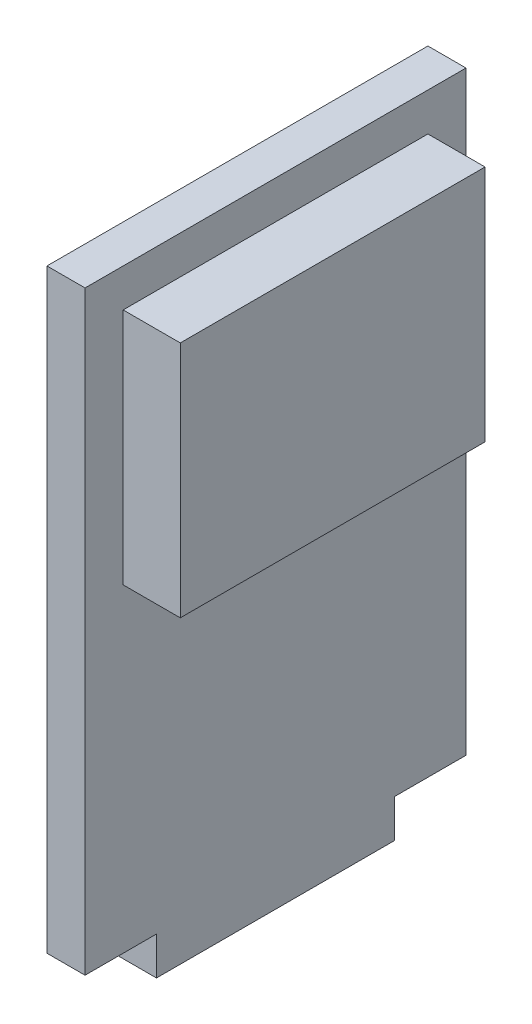
ISO-10303-21;
HEADER;
FILE_DESCRIPTION(('STEP AP214'),'2;1');
FILE_NAME('part.step','',(''),(''),'','','');
FILE_SCHEMA(('AUTOMOTIVE_DESIGN { 1 0 10303 214 1 1 1 1 }'));
ENDSEC;
DATA;
#1=APPLICATION_CONTEXT('core data for automotive mechanical design processes');
#2=APPLICATION_PROTOCOL_DEFINITION('international standard','automotive_design',2000,#1);
#3=PRODUCT_CONTEXT('',#1,'mechanical');
#4=PRODUCT('Part','Part','',(#3));
#5=PRODUCT_RELATED_PRODUCT_CATEGORY('part','',(#4));
#6=PRODUCT_DEFINITION_FORMATION('','',#4);
#7=PRODUCT_DEFINITION_CONTEXT('part definition',#1,'design');
#8=PRODUCT_DEFINITION('design','',#6,#7);
#9=PRODUCT_DEFINITION_SHAPE('','',#8);
#10=(LENGTH_UNIT() NAMED_UNIT(*) SI_UNIT(.MILLI.,.METRE.));
#11=(NAMED_UNIT(*) PLANE_ANGLE_UNIT() SI_UNIT($,.RADIAN.));
#12=(NAMED_UNIT(*) SI_UNIT($,.STERADIAN.) SOLID_ANGLE_UNIT());
#13=UNCERTAINTY_MEASURE_WITH_UNIT(LENGTH_MEASURE(1.E-05),#10,'distance_accuracy_value','');
#14=(GEOMETRIC_REPRESENTATION_CONTEXT(3) GLOBAL_UNCERTAINTY_ASSIGNED_CONTEXT((#13)) GLOBAL_UNIT_ASSIGNED_CONTEXT((#10,
#11,#12)) REPRESENTATION_CONTEXT('',''));
#15=CARTESIAN_POINT('',(0.,0.,0.));
#16=DIRECTION('',(0.,0.,1.));
#17=DIRECTION('',(1.,0.,0.));
#18=AXIS2_PLACEMENT_3D('',#15,#16,#17);
#19=CARTESIAN_POINT('',(0.8,0.,0.));
#20=DIRECTION('',(-1.,0.,0.));
#21=DIRECTION('',(0.,0.,1.));
#22=AXIS2_PLACEMENT_3D('',#19,#20,#21);
#23=PLANE('',#22);
#24=DIRECTION('',(0.,-1.,0.));
#25=VECTOR('',#24,1.);
#26=CARTESIAN_POINT('',(0.8,0.,0.));
#27=LINE('',#26,#25);
#28=CARTESIAN_POINT('',(0.8,12.5,0.));
#29=VERTEX_POINT('',#28);
#30=CARTESIAN_POINT('',(0.8,0.,0.));
#31=VERTEX_POINT('',#30);
#32=EDGE_CURVE('E158',#29,#31,#27,.T.);
#33=ORIENTED_EDGE('',*,*,#32,.T.);
#34=DIRECTION('',(0.,0.,-1.));
#35=VECTOR('',#34,1.);
#36=CARTESIAN_POINT('',(0.8,0.,0.));
#37=LINE('',#36,#35);
#38=CARTESIAN_POINT('',(0.8,0.,-1.5));
#39=VERTEX_POINT('',#38);
#40=EDGE_CURVE('E161',#31,#39,#37,.T.);
#41=ORIENTED_EDGE('',*,*,#40,.T.);
#42=DIRECTION('',(0.,-1.,0.));
#43=VECTOR('',#42,1.);
#44=CARTESIAN_POINT('',(0.8,0.,-1.5));
#45=LINE('',#44,#43);
#46=CARTESIAN_POINT('',(0.8,-0.8,-1.5));
#47=VERTEX_POINT('',#46);
#48=EDGE_CURVE('E164',#39,#47,#45,.T.);
#49=ORIENTED_EDGE('',*,*,#48,.T.);
#50=DIRECTION('',(0.,0.,-1.));
#51=VECTOR('',#50,1.);
#52=CARTESIAN_POINT('',(0.8,-0.8,-1.5));
#53=LINE('',#52,#51);
#54=CARTESIAN_POINT('',(0.8,-0.8,-6.5));
#55=VERTEX_POINT('',#54);
#56=EDGE_CURVE('E166',#47,#55,#53,.T.);
#57=ORIENTED_EDGE('',*,*,#56,.T.);
#58=DIRECTION('',(0.,1.,0.));
#59=VECTOR('',#58,1.);
#60=CARTESIAN_POINT('',(0.8,-0.8,-6.5));
#61=LINE('',#60,#59);
#62=CARTESIAN_POINT('',(0.8,0.,-6.5));
#63=VERTEX_POINT('',#62);
#64=EDGE_CURVE('E168',#55,#63,#61,.T.);
#65=ORIENTED_EDGE('',*,*,#64,.T.);
#66=DIRECTION('',(0.,0.,-1.));
#67=VECTOR('',#66,1.);
#68=CARTESIAN_POINT('',(0.8,0.,-6.5));
#69=LINE('',#68,#67);
#70=CARTESIAN_POINT('',(0.8,0.,-8.));
#71=VERTEX_POINT('',#70);
#72=EDGE_CURVE('E170',#63,#71,#69,.T.);
#73=ORIENTED_EDGE('',*,*,#72,.T.);
#74=DIRECTION('',(0.,1.,0.));
#75=VECTOR('',#74,1.);
#76=CARTESIAN_POINT('',(0.8,0.,-8.));
#77=LINE('',#76,#75);
#78=CARTESIAN_POINT('',(0.8,12.5,-8.));
#79=VERTEX_POINT('',#78);
#80=EDGE_CURVE('E172',#71,#79,#77,.T.);
#81=ORIENTED_EDGE('',*,*,#80,.T.);
#82=DIRECTION('',(0.,0.,1.));
#83=VECTOR('',#82,1.);
#84=CARTESIAN_POINT('',(0.8,12.5,0.));
#85=LINE('',#84,#83);
#86=EDGE_CURVE('E174',#79,#29,#85,.T.);
#87=ORIENTED_EDGE('',*,*,#86,.T.);
#88=EDGE_LOOP('',(#33,#41,#49,#57,#65,#73,#81,#87));
#89=FACE_BOUND('',#88,.T.);
#90=DIRECTION('',(0.,-1.,0.));
#91=VECTOR('',#90,1.);
#92=CARTESIAN_POINT('',(0.8,11.7,-0.799999999999999));
#93=LINE('',#92,#91);
#94=CARTESIAN_POINT('',(0.8,11.7,-0.799999999999999));
#95=VERTEX_POINT('',#94);
#96=CARTESIAN_POINT('',(0.8,6.7,-0.8));
#97=VERTEX_POINT('',#96);
#98=EDGE_CURVE('E148',#95,#97,#93,.T.);
#99=ORIENTED_EDGE('',*,*,#98,.F.);
#100=DIRECTION('',(0.,0.,1.));
#101=VECTOR('',#100,1.);
#102=CARTESIAN_POINT('',(0.8,11.7,-0.799999999999999));
#103=LINE('',#102,#101);
#104=CARTESIAN_POINT('',(0.8,11.7,-7.2));
#105=VERTEX_POINT('',#104);
#106=EDGE_CURVE('E145',#105,#95,#103,.T.);
#107=ORIENTED_EDGE('',*,*,#106,.F.);
#108=DIRECTION('',(0.,1.,0.));
#109=VECTOR('',#108,1.);
#110=CARTESIAN_POINT('',(0.8,11.7,-7.2));
#111=LINE('',#110,#109);
#112=CARTESIAN_POINT('',(0.8,6.7,-7.2));
#113=VERTEX_POINT('',#112);
#114=EDGE_CURVE('E59',#113,#105,#111,.T.);
#115=ORIENTED_EDGE('',*,*,#114,.F.);
#116=DIRECTION('',(0.,0.,-1.));
#117=VECTOR('',#116,1.);
#118=CARTESIAN_POINT('',(0.8,6.7,-0.8));
#119=LINE('',#118,#117);
#120=EDGE_CURVE('E54',#97,#113,#119,.T.);
#121=ORIENTED_EDGE('',*,*,#120,.F.);
#122=EDGE_LOOP('',(#99,#107,#115,#121));
#123=FACE_BOUND('',#122,.T.);
#124=ADVANCED_FACE('F39',(#89,#123),#23,.F.);
#125=CARTESIAN_POINT('',(0.8,0.,0.));
#126=DIRECTION('',(0.,0.,-1.));
#127=DIRECTION('',(-1.,0.,0.));
#128=AXIS2_PLACEMENT_3D('',#125,#126,#127);
#129=PLANE('',#128);
#130=DIRECTION('',(0.,-1.,0.));
#131=VECTOR('',#130,1.);
#132=CARTESIAN_POINT('',(0.,0.,0.));
#133=LINE('',#132,#131);
#134=CARTESIAN_POINT('',(0.,12.5,0.));
#135=VERTEX_POINT('',#134);
#136=CARTESIAN_POINT('',(0.,0.,0.));
#137=VERTEX_POINT('',#136);
#138=EDGE_CURVE('E149',#135,#137,#133,.T.);
#139=ORIENTED_EDGE('',*,*,#138,.T.);
#140=DIRECTION('',(-1.,0.,0.));
#141=VECTOR('',#140,1.);
#142=CARTESIAN_POINT('',(0.8,0.,0.));
#143=LINE('',#142,#141);
#144=EDGE_CURVE('E11',#31,#137,#143,.T.);
#145=ORIENTED_EDGE('',*,*,#144,.F.);
#146=ORIENTED_EDGE('',*,*,#32,.F.);
#147=DIRECTION('',(-1.,0.,0.));
#148=VECTOR('',#147,1.);
#149=CARTESIAN_POINT('',(0.8,12.5,0.));
#150=LINE('',#149,#148);
#151=EDGE_CURVE('E175',#29,#135,#150,.T.);
#152=ORIENTED_EDGE('',*,*,#151,.T.);
#153=EDGE_LOOP('',(#139,#145,#146,#152));
#154=FACE_BOUND('',#153,.T.);
#155=ADVANCED_FACE('F41',(#154),#129,.F.);
#156=CARTESIAN_POINT('',(0.8,0.,0.));
#157=DIRECTION('',(0.,1.,0.));
#158=DIRECTION('',(0.,0.,1.));
#159=AXIS2_PLACEMENT_3D('',#156,#157,#158);
#160=PLANE('',#159);
#161=DIRECTION('',(0.,0.,-1.));
#162=VECTOR('',#161,1.);
#163=CARTESIAN_POINT('',(0.,0.,0.));
#164=LINE('',#163,#162);
#165=CARTESIAN_POINT('',(0.,0.,-1.5));
#166=VERTEX_POINT('',#165);
#167=EDGE_CURVE('E152',#137,#166,#164,.T.);
#168=ORIENTED_EDGE('',*,*,#167,.T.);
#169=DIRECTION('',(-1.,0.,0.));
#170=VECTOR('',#169,1.);
#171=CARTESIAN_POINT('',(0.8,0.,-1.5));
#172=LINE('',#171,#170);
#173=EDGE_CURVE('E47',#39,#166,#172,.T.);
#174=ORIENTED_EDGE('',*,*,#173,.F.);
#175=ORIENTED_EDGE('',*,*,#40,.F.);
#176=ORIENTED_EDGE('',*,*,#144,.T.);
#177=EDGE_LOOP('',(#168,#174,#175,#176));
#178=FACE_BOUND('',#177,.T.);
#179=ADVANCED_FACE('F232',(#178),#160,.F.);
#180=CARTESIAN_POINT('',(0.8,0.,-1.5));
#181=DIRECTION('',(0.,0.,-1.));
#182=DIRECTION('',(-1.,0.,0.));
#183=AXIS2_PLACEMENT_3D('',#180,#181,#182);
#184=PLANE('',#183);
#185=DIRECTION('',(0.,-1.,0.));
#186=VECTOR('',#185,1.);
#187=CARTESIAN_POINT('',(0.,0.,-1.5));
#188=LINE('',#187,#186);
#189=CARTESIAN_POINT('',(0.,-0.8,-1.5));
#190=VERTEX_POINT('',#189);
#191=EDGE_CURVE('E178',#166,#190,#188,.T.);
#192=ORIENTED_EDGE('',*,*,#191,.T.);
#193=DIRECTION('',(-1.,0.,0.));
#194=VECTOR('',#193,1.);
#195=CARTESIAN_POINT('',(0.8,-0.8,-1.5));
#196=LINE('',#195,#194);
#197=EDGE_CURVE('E203',#47,#190,#196,.T.);
#198=ORIENTED_EDGE('',*,*,#197,.F.);
#199=ORIENTED_EDGE('',*,*,#48,.F.);
#200=ORIENTED_EDGE('',*,*,#173,.T.);
#201=EDGE_LOOP('',(#192,#198,#199,#200));
#202=FACE_BOUND('',#201,.T.);
#203=ADVANCED_FACE('F210',(#202),#184,.F.);
#204=CARTESIAN_POINT('',(0.8,-0.8,-1.5));
#205=DIRECTION('',(0.,1.,0.));
#206=DIRECTION('',(0.,0.,1.));
#207=AXIS2_PLACEMENT_3D('',#204,#205,#206);
#208=PLANE('',#207);
#209=DIRECTION('',(0.,0.,-1.));
#210=VECTOR('',#209,1.);
#211=CARTESIAN_POINT('',(0.,-0.8,-1.5));
#212=LINE('',#211,#210);
#213=CARTESIAN_POINT('',(0.,-0.8,-6.5));
#214=VERTEX_POINT('',#213);
#215=EDGE_CURVE('E180',#190,#214,#212,.T.);
#216=ORIENTED_EDGE('',*,*,#215,.T.);
#217=DIRECTION('',(-1.,0.,0.));
#218=VECTOR('',#217,1.);
#219=CARTESIAN_POINT('',(0.8,-0.8,-6.5));
#220=LINE('',#219,#218);
#221=EDGE_CURVE('E200',#55,#214,#220,.T.);
#222=ORIENTED_EDGE('',*,*,#221,.F.);
#223=ORIENTED_EDGE('',*,*,#56,.F.);
#224=ORIENTED_EDGE('',*,*,#197,.T.);
#225=EDGE_LOOP('',(#216,#222,#223,#224));
#226=FACE_BOUND('',#225,.T.);
#227=ADVANCED_FACE('F221',(#226),#208,.F.);
#228=CARTESIAN_POINT('',(0.8,-0.8,-6.5));
#229=DIRECTION('',(0.,0.,1.));
#230=DIRECTION('',(0.,-1.,0.));
#231=AXIS2_PLACEMENT_3D('',#228,#229,#230);
#232=PLANE('',#231);
#233=DIRECTION('',(0.,1.,0.));
#234=VECTOR('',#233,1.);
#235=CARTESIAN_POINT('',(0.,-0.8,-6.5));
#236=LINE('',#235,#234);
#237=CARTESIAN_POINT('',(0.,0.,-6.5));
#238=VERTEX_POINT('',#237);
#239=EDGE_CURVE('E182',#214,#238,#236,.T.);
#240=ORIENTED_EDGE('',*,*,#239,.T.);
#241=DIRECTION('',(-1.,0.,0.));
#242=VECTOR('',#241,1.);
#243=CARTESIAN_POINT('',(0.8,0.,-6.5));
#244=LINE('',#243,#242);
#245=EDGE_CURVE('E197',#63,#238,#244,.T.);
#246=ORIENTED_EDGE('',*,*,#245,.F.);
#247=ORIENTED_EDGE('',*,*,#64,.F.);
#248=ORIENTED_EDGE('',*,*,#221,.T.);
#249=EDGE_LOOP('',(#240,#246,#247,#248));
#250=FACE_BOUND('',#249,.T.);
#251=ADVANCED_FACE('F225',(#250),#232,.F.);
#252=CARTESIAN_POINT('',(0.8,0.,-6.5));
#253=DIRECTION('',(0.,1.,0.));
#254=DIRECTION('',(0.,0.,1.));
#255=AXIS2_PLACEMENT_3D('',#252,#253,#254);
#256=PLANE('',#255);
#257=DIRECTION('',(0.,0.,-1.));
#258=VECTOR('',#257,1.);
#259=CARTESIAN_POINT('',(0.,0.,-6.5));
#260=LINE('',#259,#258);
#261=CARTESIAN_POINT('',(0.,0.,-8.));
#262=VERTEX_POINT('',#261);
#263=EDGE_CURVE('E184',#238,#262,#260,.T.);
#264=ORIENTED_EDGE('',*,*,#263,.T.);
#265=DIRECTION('',(-1.,0.,0.));
#266=VECTOR('',#265,1.);
#267=CARTESIAN_POINT('',(0.8,0.,-8.));
#268=LINE('',#267,#266);
#269=EDGE_CURVE('E194',#71,#262,#268,.T.);
#270=ORIENTED_EDGE('',*,*,#269,.F.);
#271=ORIENTED_EDGE('',*,*,#72,.F.);
#272=ORIENTED_EDGE('',*,*,#245,.T.);
#273=EDGE_LOOP('',(#264,#270,#271,#272));
#274=FACE_BOUND('',#273,.T.);
#275=ADVANCED_FACE('F245',(#274),#256,.F.);
#276=CARTESIAN_POINT('',(0.8,0.,-8.));
#277=DIRECTION('',(0.,0.,1.));
#278=DIRECTION('',(1.,0.,0.));
#279=AXIS2_PLACEMENT_3D('',#276,#277,#278);
#280=PLANE('',#279);
#281=DIRECTION('',(0.,1.,0.));
#282=VECTOR('',#281,1.);
#283=CARTESIAN_POINT('',(0.,0.,-8.));
#284=LINE('',#283,#282);
#285=CARTESIAN_POINT('',(0.,12.5,-8.));
#286=VERTEX_POINT('',#285);
#287=EDGE_CURVE('E186',#262,#286,#284,.T.);
#288=ORIENTED_EDGE('',*,*,#287,.T.);
#289=DIRECTION('',(-1.,0.,0.));
#290=VECTOR('',#289,1.);
#291=CARTESIAN_POINT('',(0.8,12.5,-8.));
#292=LINE('',#291,#290);
#293=EDGE_CURVE('E191',#79,#286,#292,.T.);
#294=ORIENTED_EDGE('',*,*,#293,.F.);
#295=ORIENTED_EDGE('',*,*,#80,.F.);
#296=ORIENTED_EDGE('',*,*,#269,.T.);
#297=EDGE_LOOP('',(#288,#294,#295,#296));
#298=FACE_BOUND('',#297,.T.);
#299=ADVANCED_FACE('F243',(#298),#280,.F.);
#300=CARTESIAN_POINT('',(0.8,12.5,0.));
#301=DIRECTION('',(0.,-1.,0.));
#302=DIRECTION('',(0.,0.,-1.));
#303=AXIS2_PLACEMENT_3D('',#300,#301,#302);
#304=PLANE('',#303);
#305=DIRECTION('',(0.,0.,1.));
#306=VECTOR('',#305,1.);
#307=CARTESIAN_POINT('',(0.,12.5,0.));
#308=LINE('',#307,#306);
#309=EDGE_CURVE('E162',#286,#135,#308,.T.);
#310=ORIENTED_EDGE('',*,*,#309,.T.);
#311=ORIENTED_EDGE('',*,*,#151,.F.);
#312=ORIENTED_EDGE('',*,*,#86,.F.);
#313=ORIENTED_EDGE('',*,*,#293,.T.);
#314=EDGE_LOOP('',(#310,#311,#312,#313));
#315=FACE_BOUND('',#314,.T.);
#316=ADVANCED_FACE('F238',(#315),#304,.F.);
#317=CARTESIAN_POINT('',(0.,0.,0.));
#318=DIRECTION('',(-1.,0.,0.));
#319=DIRECTION('',(0.,0.,1.));
#320=AXIS2_PLACEMENT_3D('',#317,#318,#319);
#321=PLANE('',#320);
#322=ORIENTED_EDGE('',*,*,#138,.F.);
#323=ORIENTED_EDGE('',*,*,#309,.F.);
#324=ORIENTED_EDGE('',*,*,#287,.F.);
#325=ORIENTED_EDGE('',*,*,#263,.F.);
#326=ORIENTED_EDGE('',*,*,#239,.F.);
#327=ORIENTED_EDGE('',*,*,#215,.F.);
#328=ORIENTED_EDGE('',*,*,#191,.F.);
#329=ORIENTED_EDGE('',*,*,#167,.F.);
#330=EDGE_LOOP('',(#322,#323,#324,#325,#326,#327,#328,#329));
#331=FACE_BOUND('',#330,.T.);
#332=ADVANCED_FACE('F216',(#331),#321,.T.);
#333=CARTESIAN_POINT('',(2.,11.7,-0.799999999999999));
#334=DIRECTION('',(0.,0.,-1.));
#335=DIRECTION('',(0.,1.,0.));
#336=AXIS2_PLACEMENT_3D('',#333,#334,#335);
#337=PLANE('',#336);
#338=ORIENTED_EDGE('',*,*,#98,.T.);
#339=DIRECTION('',(-1.,0.,0.));
#340=VECTOR('',#339,1.);
#341=CARTESIAN_POINT('',(2.,6.7,-0.8));
#342=LINE('',#341,#340);
#343=CARTESIAN_POINT('',(2.,6.7,-0.8));
#344=VERTEX_POINT('',#343);
#345=EDGE_CURVE('E129',#344,#97,#342,.T.);
#346=ORIENTED_EDGE('',*,*,#345,.F.);
#347=DIRECTION('',(0.,-1.,0.));
#348=VECTOR('',#347,1.);
#349=CARTESIAN_POINT('',(2.,11.7,-0.799999999999999));
#350=LINE('',#349,#348);
#351=CARTESIAN_POINT('',(2.,11.7,-0.799999999999999));
#352=VERTEX_POINT('',#351);
#353=EDGE_CURVE('E136',#352,#344,#350,.T.);
#354=ORIENTED_EDGE('',*,*,#353,.F.);
#355=DIRECTION('',(-1.,0.,0.));
#356=VECTOR('',#355,1.);
#357=CARTESIAN_POINT('',(2.,11.7,-0.799999999999999));
#358=LINE('',#357,#356);
#359=EDGE_CURVE('E326',#352,#95,#358,.T.);
#360=ORIENTED_EDGE('',*,*,#359,.T.);
#361=EDGE_LOOP('',(#338,#346,#354,#360));
#362=FACE_BOUND('',#361,.T.);
#363=ADVANCED_FACE('F147',(#362),#337,.F.);
#364=CARTESIAN_POINT('',(2.,6.7,-0.8));
#365=DIRECTION('',(0.,1.,0.));
#366=DIRECTION('',(0.,0.,1.));
#367=AXIS2_PLACEMENT_3D('',#364,#365,#366);
#368=PLANE('',#367);
#369=ORIENTED_EDGE('',*,*,#120,.T.);
#370=DIRECTION('',(-1.,0.,0.));
#371=VECTOR('',#370,1.);
#372=CARTESIAN_POINT('',(2.,6.7,-7.2));
#373=LINE('',#372,#371);
#374=CARTESIAN_POINT('',(2.,6.7,-7.2));
#375=VERTEX_POINT('',#374);
#376=EDGE_CURVE('E132',#375,#113,#373,.T.);
#377=ORIENTED_EDGE('',*,*,#376,.F.);
#378=DIRECTION('',(0.,0.,-1.));
#379=VECTOR('',#378,1.);
#380=CARTESIAN_POINT('',(2.,6.7,-0.8));
#381=LINE('',#380,#379);
#382=EDGE_CURVE('E125',#344,#375,#381,.T.);
#383=ORIENTED_EDGE('',*,*,#382,.F.);
#384=ORIENTED_EDGE('',*,*,#345,.T.);
#385=EDGE_LOOP('',(#369,#377,#383,#384));
#386=FACE_BOUND('',#385,.T.);
#387=ADVANCED_FACE('F127',(#386),#368,.F.);
#388=CARTESIAN_POINT('',(2.,11.7,-7.2));
#389=DIRECTION('',(0.,0.,1.));
#390=DIRECTION('',(0.,-1.,0.));
#391=AXIS2_PLACEMENT_3D('',#388,#389,#390);
#392=PLANE('',#391);
#393=ORIENTED_EDGE('',*,*,#114,.T.);
#394=DIRECTION('',(-1.,0.,0.));
#395=VECTOR('',#394,1.);
#396=CARTESIAN_POINT('',(2.,11.7,-7.2));
#397=LINE('',#396,#395);
#398=CARTESIAN_POINT('',(2.,11.7,-7.2));
#399=VERTEX_POINT('',#398);
#400=EDGE_CURVE('E154',#399,#105,#397,.T.);
#401=ORIENTED_EDGE('',*,*,#400,.F.);
#402=DIRECTION('',(0.,1.,0.));
#403=VECTOR('',#402,1.);
#404=CARTESIAN_POINT('',(2.,11.7,-7.2));
#405=LINE('',#404,#403);
#406=EDGE_CURVE('E135',#375,#399,#405,.T.);
#407=ORIENTED_EDGE('',*,*,#406,.F.);
#408=ORIENTED_EDGE('',*,*,#376,.T.);
#409=EDGE_LOOP('',(#393,#401,#407,#408));
#410=FACE_BOUND('',#409,.T.);
#411=ADVANCED_FACE('F295',(#410),#392,.F.);
#412=CARTESIAN_POINT('',(2.,11.7,-0.799999999999999));
#413=DIRECTION('',(0.,-1.,0.));
#414=DIRECTION('',(0.,0.,-1.));
#415=AXIS2_PLACEMENT_3D('',#412,#413,#414);
#416=PLANE('',#415);
#417=ORIENTED_EDGE('',*,*,#106,.T.);
#418=ORIENTED_EDGE('',*,*,#359,.F.);
#419=DIRECTION('',(0.,0.,1.));
#420=VECTOR('',#419,1.);
#421=CARTESIAN_POINT('',(2.,11.7,-0.799999999999999));
#422=LINE('',#421,#420);
#423=EDGE_CURVE('E141',#399,#352,#422,.T.);
#424=ORIENTED_EDGE('',*,*,#423,.F.);
#425=ORIENTED_EDGE('',*,*,#400,.T.);
#426=EDGE_LOOP('',(#417,#418,#424,#425));
#427=FACE_BOUND('',#426,.T.);
#428=ADVANCED_FACE('F303',(#427),#416,.F.);
#429=CARTESIAN_POINT('',(2.,0.,0.));
#430=DIRECTION('',(1.,0.,0.));
#431=DIRECTION('',(0.,0.,-1.));
#432=AXIS2_PLACEMENT_3D('',#429,#430,#431);
#433=PLANE('',#432);
#434=ORIENTED_EDGE('',*,*,#353,.T.);
#435=ORIENTED_EDGE('',*,*,#382,.T.);
#436=ORIENTED_EDGE('',*,*,#406,.T.);
#437=ORIENTED_EDGE('',*,*,#423,.T.);
#438=EDGE_LOOP('',(#434,#435,#436,#437));
#439=FACE_BOUND('',#438,.T.);
#440=ADVANCED_FACE('F139',(#439),#433,.T.);
#441=CLOSED_SHELL('',(#124,#155,#179,#203,#227,#251,#275,#299,#316,#332,#363,#387,#411,#428,#440));
#442=MANIFOLD_SOLID_BREP('B2',#441);
#443=ADVANCED_BREP_SHAPE_REPRESENTATION('',(#18,#442),#14);
#444=SHAPE_DEFINITION_REPRESENTATION(#9,#443);
ENDSEC;
END-ISO-10303-21;
